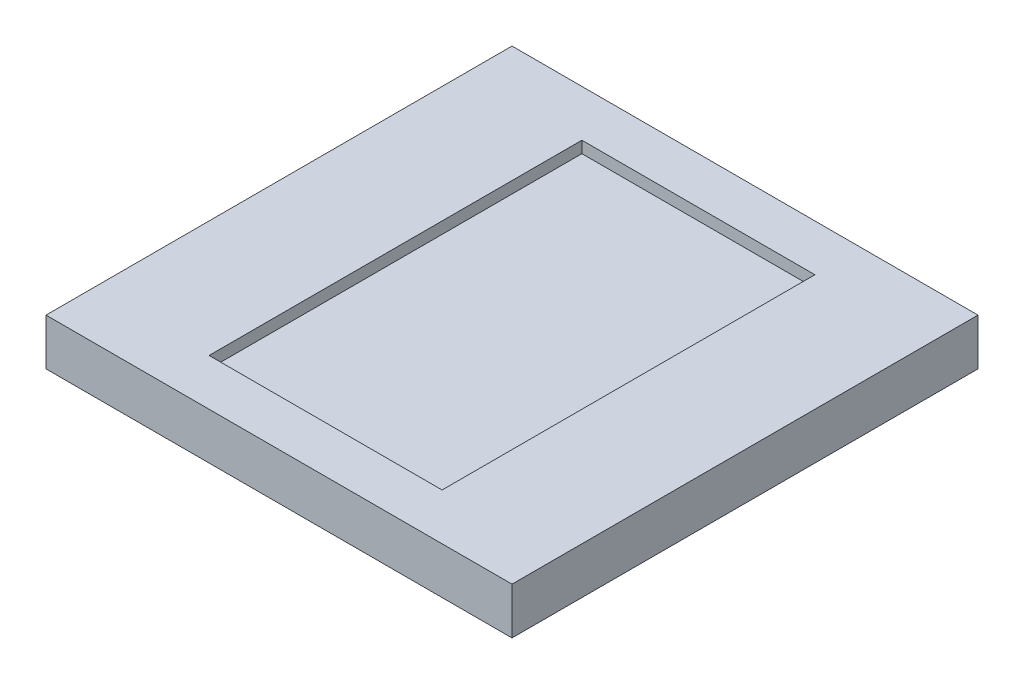
ISO-10303-21;
HEADER;
FILE_DESCRIPTION(('STEP AP214'),'2;1');
FILE_NAME('part.step','',(''),(''),'','','');
FILE_SCHEMA(('AUTOMOTIVE_DESIGN { 1 0 10303 214 1 1 1 1 }'));
ENDSEC;
DATA;
#1=APPLICATION_CONTEXT('core data for automotive mechanical design processes');
#2=APPLICATION_PROTOCOL_DEFINITION('international standard','automotive_design',2000,#1);
#3=PRODUCT_CONTEXT('',#1,'mechanical');
#4=PRODUCT('Part','Part','',(#3));
#5=PRODUCT_RELATED_PRODUCT_CATEGORY('part','',(#4));
#6=PRODUCT_DEFINITION_FORMATION('','',#4);
#7=PRODUCT_DEFINITION_CONTEXT('part definition',#1,'design');
#8=PRODUCT_DEFINITION('design','',#6,#7);
#9=PRODUCT_DEFINITION_SHAPE('','',#8);
#10=(LENGTH_UNIT() NAMED_UNIT(*) SI_UNIT(.MILLI.,.METRE.));
#11=(NAMED_UNIT(*) PLANE_ANGLE_UNIT() SI_UNIT($,.RADIAN.));
#12=(NAMED_UNIT(*) SI_UNIT($,.STERADIAN.) SOLID_ANGLE_UNIT());
#13=UNCERTAINTY_MEASURE_WITH_UNIT(LENGTH_MEASURE(1.E-05),#10,'distance_accuracy_value','');
#14=(GEOMETRIC_REPRESENTATION_CONTEXT(3) GLOBAL_UNCERTAINTY_ASSIGNED_CONTEXT((#13)) GLOBAL_UNIT_ASSIGNED_CONTEXT((#10,
#11,#12)) REPRESENTATION_CONTEXT('',''));
#15=CARTESIAN_POINT('',(0.,0.,0.));
#16=DIRECTION('',(0.,0.,1.));
#17=DIRECTION('',(1.,0.,0.));
#18=AXIS2_PLACEMENT_3D('',#15,#16,#17);
#19=CARTESIAN_POINT('',(0.,1.,0.));
#20=DIRECTION('',(1.,0.,0.));
#21=DIRECTION('',(0.,0.,-1.));
#22=AXIS2_PLACEMENT_3D('',#19,#20,#21);
#23=PLANE('',#22);
#24=DIRECTION('',(0.,0.,1.));
#25=VECTOR('',#24,1.);
#26=CARTESIAN_POINT('',(0.,0.,0.));
#27=LINE('',#26,#25);
#28=CARTESIAN_POINT('',(0.,0.,-10.));
#29=VERTEX_POINT('',#28);
#30=CARTESIAN_POINT('',(0.,0.,0.));
#31=VERTEX_POINT('',#30);
#32=EDGE_CURVE('E160',#29,#31,#27,.T.);
#33=ORIENTED_EDGE('',*,*,#32,.T.);
#34=DIRECTION('',(0.,-1.,0.));
#35=VECTOR('',#34,1.);
#36=CARTESIAN_POINT('',(0.,1.,0.));
#37=LINE('',#36,#35);
#38=CARTESIAN_POINT('',(0.,1.,0.));
#39=VERTEX_POINT('',#38);
#40=EDGE_CURVE('E11',#39,#31,#37,.T.);
#41=ORIENTED_EDGE('',*,*,#40,.F.);
#42=DIRECTION('',(0.,0.,1.));
#43=VECTOR('',#42,1.);
#44=CARTESIAN_POINT('',(0.,1.,0.));
#45=LINE('',#44,#43);
#46=CARTESIAN_POINT('',(0.,1.,-10.));
#47=VERTEX_POINT('',#46);
#48=EDGE_CURVE('E166',#47,#39,#45,.T.);
#49=ORIENTED_EDGE('',*,*,#48,.F.);
#50=DIRECTION('',(0.,-1.,0.));
#51=VECTOR('',#50,1.);
#52=CARTESIAN_POINT('',(0.,1.,-10.));
#53=LINE('',#52,#51);
#54=EDGE_CURVE('E176',#47,#29,#53,.T.);
#55=ORIENTED_EDGE('',*,*,#54,.T.);
#56=EDGE_LOOP('',(#33,#41,#49,#55));
#57=FACE_BOUND('',#56,.T.);
#58=ADVANCED_FACE('F41',(#57),#23,.F.);
#59=CARTESIAN_POINT('',(0.,1.,0.));
#60=DIRECTION('',(0.,0.,-1.));
#61=DIRECTION('',(-1.,0.,0.));
#62=AXIS2_PLACEMENT_3D('',#59,#60,#61);
#63=PLANE('',#62);
#64=DIRECTION('',(1.,0.,0.));
#65=VECTOR('',#64,1.);
#66=CARTESIAN_POINT('',(0.,0.,0.));
#67=LINE('',#66,#65);
#68=CARTESIAN_POINT('',(10.,0.,0.));
#69=VERTEX_POINT('',#68);
#70=EDGE_CURVE('E180',#31,#69,#67,.T.);
#71=ORIENTED_EDGE('',*,*,#70,.T.);
#72=DIRECTION('',(0.,-1.,0.));
#73=VECTOR('',#72,1.);
#74=CARTESIAN_POINT('',(10.,1.,0.));
#75=LINE('',#74,#73);
#76=CARTESIAN_POINT('',(10.,1.,0.));
#77=VERTEX_POINT('',#76);
#78=EDGE_CURVE('E49',#77,#69,#75,.T.);
#79=ORIENTED_EDGE('',*,*,#78,.F.);
#80=DIRECTION('',(1.,0.,0.));
#81=VECTOR('',#80,1.);
#82=CARTESIAN_POINT('',(0.,1.,0.));
#83=LINE('',#82,#81);
#84=EDGE_CURVE('E93',#39,#77,#83,.T.);
#85=ORIENTED_EDGE('',*,*,#84,.F.);
#86=ORIENTED_EDGE('',*,*,#40,.T.);
#87=EDGE_LOOP('',(#71,#79,#85,#86));
#88=FACE_BOUND('',#87,.T.);
#89=ADVANCED_FACE('F215',(#88),#63,.F.);
#90=CARTESIAN_POINT('',(10.,1.,0.));
#91=DIRECTION('',(-1.,0.,0.));
#92=DIRECTION('',(0.,0.,1.));
#93=AXIS2_PLACEMENT_3D('',#90,#91,#92);
#94=PLANE('',#93);
#95=DIRECTION('',(0.,0.,-1.));
#96=VECTOR('',#95,1.);
#97=CARTESIAN_POINT('',(10.,0.,0.));
#98=LINE('',#97,#96);
#99=CARTESIAN_POINT('',(10.,0.,-10.));
#100=VERTEX_POINT('',#99);
#101=EDGE_CURVE('E183',#69,#100,#98,.T.);
#102=ORIENTED_EDGE('',*,*,#101,.T.);
#103=DIRECTION('',(0.,-1.,0.));
#104=VECTOR('',#103,1.);
#105=CARTESIAN_POINT('',(10.,1.,-10.));
#106=LINE('',#105,#104);
#107=CARTESIAN_POINT('',(10.,1.,-10.));
#108=VERTEX_POINT('',#107);
#109=EDGE_CURVE('E190',#108,#100,#106,.T.);
#110=ORIENTED_EDGE('',*,*,#109,.F.);
#111=DIRECTION('',(0.,0.,-1.));
#112=VECTOR('',#111,1.);
#113=CARTESIAN_POINT('',(10.,1.,0.));
#114=LINE('',#113,#112);
#115=EDGE_CURVE('E171',#77,#108,#114,.T.);
#116=ORIENTED_EDGE('',*,*,#115,.F.);
#117=ORIENTED_EDGE('',*,*,#78,.T.);
#118=EDGE_LOOP('',(#102,#110,#116,#117));
#119=FACE_BOUND('',#118,.T.);
#120=ADVANCED_FACE('F197',(#119),#94,.F.);
#121=CARTESIAN_POINT('',(0.,1.,-10.));
#122=DIRECTION('',(0.,0.,1.));
#123=DIRECTION('',(1.,0.,0.));
#124=AXIS2_PLACEMENT_3D('',#121,#122,#123);
#125=PLANE('',#124);
#126=DIRECTION('',(-1.,0.,0.));
#127=VECTOR('',#126,1.);
#128=CARTESIAN_POINT('',(0.,0.,-10.));
#129=LINE('',#128,#127);
#130=EDGE_CURVE('E86',#100,#29,#129,.T.);
#131=ORIENTED_EDGE('',*,*,#130,.T.);
#132=ORIENTED_EDGE('',*,*,#54,.F.);
#133=DIRECTION('',(-1.,0.,0.));
#134=VECTOR('',#133,1.);
#135=CARTESIAN_POINT('',(0.,1.,-10.));
#136=LINE('',#135,#134);
#137=EDGE_CURVE('E65',#108,#47,#136,.T.);
#138=ORIENTED_EDGE('',*,*,#137,.F.);
#139=ORIENTED_EDGE('',*,*,#109,.T.);
#140=EDGE_LOOP('',(#131,#132,#138,#139));
#141=FACE_BOUND('',#140,.T.);
#142=ADVANCED_FACE('F205',(#141),#125,.F.);
#143=CARTESIAN_POINT('',(0.,1.,0.));
#144=DIRECTION('',(0.,-1.,0.));
#145=DIRECTION('',(0.,0.,-1.));
#146=AXIS2_PLACEMENT_3D('',#143,#144,#145);
#147=PLANE('',#146);
#148=DIRECTION('',(1.,0.,0.));
#149=VECTOR('',#148,1.);
#150=CARTESIAN_POINT('',(2.5,1.,-1.));
#151=LINE('',#150,#149);
#152=CARTESIAN_POINT('',(2.5,1.,-1.));
#153=VERTEX_POINT('',#152);
#154=CARTESIAN_POINT('',(7.5,1.,-1.));
#155=VERTEX_POINT('',#154);
#156=EDGE_CURVE('E151',#153,#155,#151,.T.);
#157=ORIENTED_EDGE('',*,*,#156,.F.);
#158=DIRECTION('',(0.,0.,1.));
#159=VECTOR('',#158,1.);
#160=CARTESIAN_POINT('',(2.5,1.,-9.));
#161=LINE('',#160,#159);
#162=CARTESIAN_POINT('',(2.5,1.,-9.));
#163=VERTEX_POINT('',#162);
#164=EDGE_CURVE('E56',#163,#153,#161,.T.);
#165=ORIENTED_EDGE('',*,*,#164,.F.);
#166=DIRECTION('',(-1.,0.,0.));
#167=VECTOR('',#166,1.);
#168=CARTESIAN_POINT('',(2.5,1.,-9.));
#169=LINE('',#168,#167);
#170=CARTESIAN_POINT('',(7.5,1.,-9.));
#171=VERTEX_POINT('',#170);
#172=EDGE_CURVE('E138',#171,#163,#169,.T.);
#173=ORIENTED_EDGE('',*,*,#172,.F.);
#174=DIRECTION('',(0.,0.,-1.));
#175=VECTOR('',#174,1.);
#176=CARTESIAN_POINT('',(7.5,1.,-9.));
#177=LINE('',#176,#175);
#178=EDGE_CURVE('E142',#155,#171,#177,.T.);
#179=ORIENTED_EDGE('',*,*,#178,.F.);
#180=EDGE_LOOP('',(#157,#165,#173,#179));
#181=FACE_BOUND('',#180,.T.);
#182=ORIENTED_EDGE('',*,*,#48,.T.);
#183=ORIENTED_EDGE('',*,*,#84,.T.);
#184=ORIENTED_EDGE('',*,*,#115,.T.);
#185=ORIENTED_EDGE('',*,*,#137,.T.);
#186=EDGE_LOOP('',(#182,#183,#184,#185));
#187=FACE_BOUND('',#186,.T.);
#188=ADVANCED_FACE('F207',(#181,#187),#147,.F.);
#189=CARTESIAN_POINT('',(0.,0.,0.));
#190=DIRECTION('',(0.,-1.,0.));
#191=DIRECTION('',(0.,0.,-1.));
#192=AXIS2_PLACEMENT_3D('',#189,#190,#191);
#193=PLANE('',#192);
#194=ORIENTED_EDGE('',*,*,#32,.F.);
#195=ORIENTED_EDGE('',*,*,#130,.F.);
#196=ORIENTED_EDGE('',*,*,#101,.F.);
#197=ORIENTED_EDGE('',*,*,#70,.F.);
#198=EDGE_LOOP('',(#194,#195,#196,#197));
#199=FACE_BOUND('',#198,.T.);
#200=ADVANCED_FACE('F201',(#199),#193,.T.);
#201=CARTESIAN_POINT('',(2.5,0.75,-9.));
#202=DIRECTION('',(-1.,0.,0.));
#203=DIRECTION('',(0.,0.,1.));
#204=AXIS2_PLACEMENT_3D('',#201,#202,#203);
#205=PLANE('',#204);
#206=ORIENTED_EDGE('',*,*,#164,.T.);
#207=DIRECTION('',(0.,1.,0.));
#208=VECTOR('',#207,1.);
#209=CARTESIAN_POINT('',(2.5,0.75,-1.));
#210=LINE('',#209,#208);
#211=CARTESIAN_POINT('',(2.5,0.75,-1.));
#212=VERTEX_POINT('',#211);
#213=EDGE_CURVE('E113',#212,#153,#210,.T.);
#214=ORIENTED_EDGE('',*,*,#213,.F.);
#215=DIRECTION('',(0.,0.,1.));
#216=VECTOR('',#215,1.);
#217=CARTESIAN_POINT('',(2.5,0.75,-9.));
#218=LINE('',#217,#216);
#219=CARTESIAN_POINT('',(2.5,0.75,-9.));
#220=VERTEX_POINT('',#219);
#221=EDGE_CURVE('E117',#220,#212,#218,.T.);
#222=ORIENTED_EDGE('',*,*,#221,.F.);
#223=DIRECTION('',(0.,1.,0.));
#224=VECTOR('',#223,1.);
#225=CARTESIAN_POINT('',(2.5,0.75,-9.));
#226=LINE('',#225,#224);
#227=EDGE_CURVE('E157',#220,#163,#226,.T.);
#228=ORIENTED_EDGE('',*,*,#227,.T.);
#229=EDGE_LOOP('',(#206,#214,#222,#228));
#230=FACE_BOUND('',#229,.T.);
#231=ADVANCED_FACE('F115',(#230),#205,.F.);
#232=CARTESIAN_POINT('',(2.5,0.75,-9.));
#233=DIRECTION('',(0.,0.,-1.));
#234=DIRECTION('',(-1.,0.,0.));
#235=AXIS2_PLACEMENT_3D('',#232,#233,#234);
#236=PLANE('',#235);
#237=ORIENTED_EDGE('',*,*,#172,.T.);
#238=ORIENTED_EDGE('',*,*,#227,.F.);
#239=DIRECTION('',(-1.,0.,0.));
#240=VECTOR('',#239,1.);
#241=CARTESIAN_POINT('',(2.5,0.75,-9.));
#242=LINE('',#241,#240);
#243=CARTESIAN_POINT('',(7.5,0.75,-9.));
#244=VERTEX_POINT('',#243);
#245=EDGE_CURVE('E124',#244,#220,#242,.T.);
#246=ORIENTED_EDGE('',*,*,#245,.F.);
#247=DIRECTION('',(0.,1.,0.));
#248=VECTOR('',#247,1.);
#249=CARTESIAN_POINT('',(7.5,0.75,-9.));
#250=LINE('',#249,#248);
#251=EDGE_CURVE('E161',#244,#171,#250,.T.);
#252=ORIENTED_EDGE('',*,*,#251,.T.);
#253=EDGE_LOOP('',(#237,#238,#246,#252));
#254=FACE_BOUND('',#253,.T.);
#255=ADVANCED_FACE('F254',(#254),#236,.F.);
#256=CARTESIAN_POINT('',(7.5,0.75,-9.));
#257=DIRECTION('',(1.,0.,0.));
#258=DIRECTION('',(0.,0.,-1.));
#259=AXIS2_PLACEMENT_3D('',#256,#257,#258);
#260=PLANE('',#259);
#261=ORIENTED_EDGE('',*,*,#178,.T.);
#262=ORIENTED_EDGE('',*,*,#251,.F.);
#263=DIRECTION('',(0.,0.,-1.));
#264=VECTOR('',#263,1.);
#265=CARTESIAN_POINT('',(7.5,0.75,-9.));
#266=LINE('',#265,#264);
#267=CARTESIAN_POINT('',(7.5,0.75,-1.));
#268=VERTEX_POINT('',#267);
#269=EDGE_CURVE('E133',#268,#244,#266,.T.);
#270=ORIENTED_EDGE('',*,*,#269,.F.);
#271=DIRECTION('',(0.,1.,0.));
#272=VECTOR('',#271,1.);
#273=CARTESIAN_POINT('',(7.5,0.75,-1.));
#274=LINE('',#273,#272);
#275=EDGE_CURVE('E123',#268,#155,#274,.T.);
#276=ORIENTED_EDGE('',*,*,#275,.T.);
#277=EDGE_LOOP('',(#261,#262,#270,#276));
#278=FACE_BOUND('',#277,.T.);
#279=ADVANCED_FACE('F263',(#278),#260,.F.);
#280=CARTESIAN_POINT('',(2.5,0.75,-1.));
#281=DIRECTION('',(0.,0.,1.));
#282=DIRECTION('',(1.,0.,0.));
#283=AXIS2_PLACEMENT_3D('',#280,#281,#282);
#284=PLANE('',#283);
#285=ORIENTED_EDGE('',*,*,#156,.T.);
#286=ORIENTED_EDGE('',*,*,#275,.F.);
#287=DIRECTION('',(1.,0.,0.));
#288=VECTOR('',#287,1.);
#289=CARTESIAN_POINT('',(2.5,0.75,-1.));
#290=LINE('',#289,#288);
#291=EDGE_CURVE('E127',#212,#268,#290,.T.);
#292=ORIENTED_EDGE('',*,*,#291,.F.);
#293=ORIENTED_EDGE('',*,*,#213,.T.);
#294=EDGE_LOOP('',(#285,#286,#292,#293));
#295=FACE_BOUND('',#294,.T.);
#296=ADVANCED_FACE('F128',(#295),#284,.F.);
#297=CARTESIAN_POINT('',(0.,0.75,0.));
#298=DIRECTION('',(0.,1.,0.));
#299=DIRECTION('',(0.,0.,1.));
#300=AXIS2_PLACEMENT_3D('',#297,#298,#299);
#301=PLANE('',#300);
#302=ORIENTED_EDGE('',*,*,#221,.T.);
#303=ORIENTED_EDGE('',*,*,#291,.T.);
#304=ORIENTED_EDGE('',*,*,#269,.T.);
#305=ORIENTED_EDGE('',*,*,#245,.T.);
#306=EDGE_LOOP('',(#302,#303,#304,#305));
#307=FACE_BOUND('',#306,.T.);
#308=ADVANCED_FACE('F135',(#307),#301,.T.);
#309=CLOSED_SHELL('',(#58,#89,#120,#142,#188,#200,#231,#255,#279,#296,#308));
#310=MANIFOLD_SOLID_BREP('B2',#309);
#311=ADVANCED_BREP_SHAPE_REPRESENTATION('',(#18,#310),#14);
#312=SHAPE_DEFINITION_REPRESENTATION(#9,#311);
ENDSEC;
END-ISO-10303-21;
